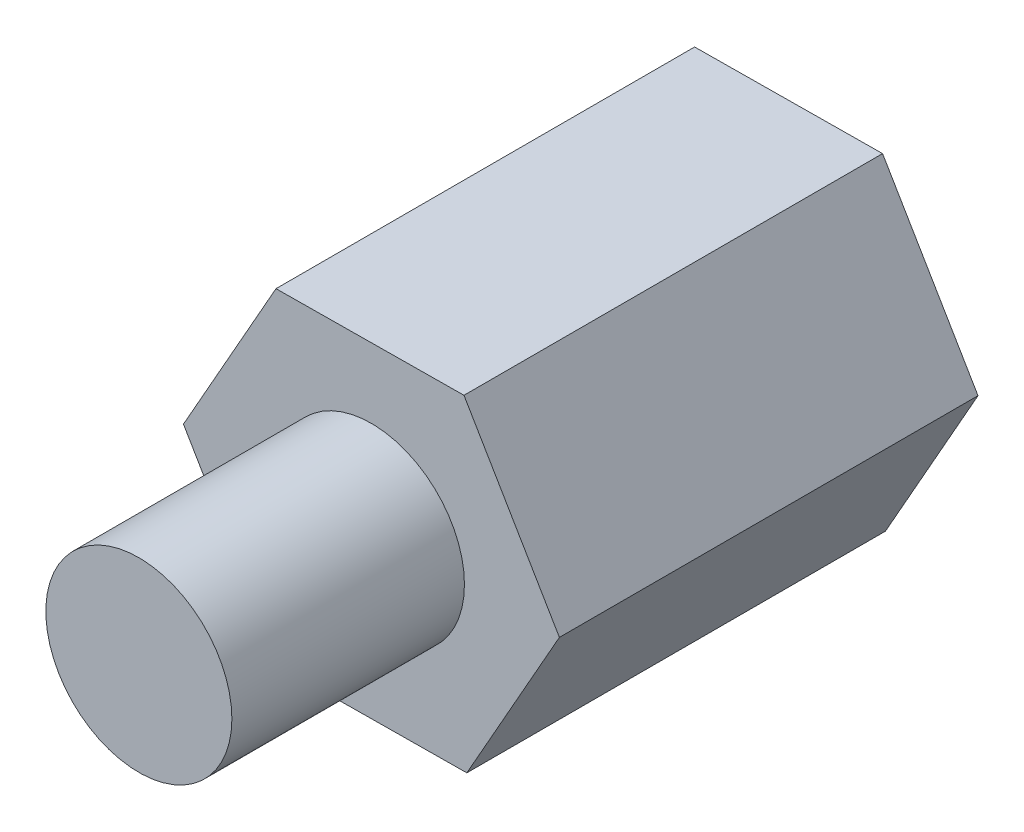
ISO-10303-21;
HEADER;
FILE_DESCRIPTION(('STEP AP214'),'2;1');
FILE_NAME('part.step','',(''),(''),'','','');
FILE_SCHEMA(('AUTOMOTIVE_DESIGN { 1 0 10303 214 1 1 1 1 }'));
ENDSEC;
DATA;
#1=APPLICATION_CONTEXT('core data for automotive mechanical design processes');
#2=APPLICATION_PROTOCOL_DEFINITION('international standard','automotive_design',2000,#1);
#3=PRODUCT_CONTEXT('',#1,'mechanical');
#4=PRODUCT('Part','Part','',(#3));
#5=PRODUCT_RELATED_PRODUCT_CATEGORY('part','',(#4));
#6=PRODUCT_DEFINITION_FORMATION('','',#4);
#7=PRODUCT_DEFINITION_CONTEXT('part definition',#1,'design');
#8=PRODUCT_DEFINITION('design','',#6,#7);
#9=PRODUCT_DEFINITION_SHAPE('','',#8);
#10=(LENGTH_UNIT() NAMED_UNIT(*) SI_UNIT(.MILLI.,.METRE.));
#11=(NAMED_UNIT(*) PLANE_ANGLE_UNIT() SI_UNIT($,.RADIAN.));
#12=(NAMED_UNIT(*) SI_UNIT($,.STERADIAN.) SOLID_ANGLE_UNIT());
#13=UNCERTAINTY_MEASURE_WITH_UNIT(LENGTH_MEASURE(1.E-05),#10,'distance_accuracy_value','');
#14=(GEOMETRIC_REPRESENTATION_CONTEXT(3) GLOBAL_UNCERTAINTY_ASSIGNED_CONTEXT((#13)) GLOBAL_UNIT_ASSIGNED_CONTEXT((#10,
#11,#12)) REPRESENTATION_CONTEXT('',''));
#15=CARTESIAN_POINT('',(0.,0.,0.));
#16=DIRECTION('',(0.,0.,1.));
#17=DIRECTION('',(1.,0.,0.));
#18=AXIS2_PLACEMENT_3D('',#15,#16,#17);
#19=CARTESIAN_POINT('',(0.,0.,14.));
#20=DIRECTION('',(0.,0.,-1.));
#21=DIRECTION('',(-1.,0.,0.));
#22=AXIS2_PLACEMENT_3D('',#19,#20,#21);
#23=CYLINDRICAL_SURFACE('',#22,2.);
#24=CARTESIAN_POINT('',(0.,0.,14.));
#25=DIRECTION('',(0.,0.,1.));
#26=DIRECTION('',(1.,0.,0.));
#27=AXIS2_PLACEMENT_3D('',#24,#25,#26);
#28=CIRCLE('',#27,2.);
#29=CARTESIAN_POINT('',(2.,0.,14.));
#30=VERTEX_POINT('',#29);
#31=EDGE_CURVE('E11',#30,#30,#28,.T.);
#32=ORIENTED_EDGE('',*,*,#31,.F.);
#33=EDGE_LOOP('',(#32));
#34=FACE_BOUND('',#33,.T.);
#35=CARTESIAN_POINT('',(0.,0.,9.));
#36=DIRECTION('',(0.,0.,1.));
#37=DIRECTION('',(1.,0.,0.));
#38=AXIS2_PLACEMENT_3D('',#35,#36,#37);
#39=CIRCLE('',#38,2.);
#40=CARTESIAN_POINT('',(2.,0.,9.));
#41=VERTEX_POINT('',#40);
#42=EDGE_CURVE('E50',#41,#41,#39,.T.);
#43=ORIENTED_EDGE('',*,*,#42,.T.);
#44=EDGE_LOOP('',(#43));
#45=FACE_BOUND('',#44,.T.);
#46=ADVANCED_FACE('F47',(#34,#45),#23,.T.);
#47=CARTESIAN_POINT('',(0.,0.,14.));
#48=DIRECTION('',(0.,0.,1.));
#49=DIRECTION('',(1.,0.,0.));
#50=AXIS2_PLACEMENT_3D('',#47,#48,#49);
#51=PLANE('',#50);
#52=ORIENTED_EDGE('',*,*,#31,.T.);
#53=EDGE_LOOP('',(#52));
#54=FACE_BOUND('',#53,.T.);
#55=ADVANCED_FACE('F62',(#54),#51,.T.);
#56=CARTESIAN_POINT('',(0.,0.,9.));
#57=DIRECTION('',(0.,0.,1.));
#58=DIRECTION('',(1.,0.,0.));
#59=AXIS2_PLACEMENT_3D('',#56,#57,#58);
#60=PLANE('',#59);
#61=ORIENTED_EDGE('',*,*,#42,.F.);
#62=EDGE_LOOP('',(#61));
#63=FACE_BOUND('',#62,.T.);
#64=ADVANCED_FACE('F60',(#63),#60,.F.);
#65=CLOSED_SHELL('',(#46,#55,#64));
#66=MANIFOLD_SOLID_BREP('B2',#65);
#67=CARTESIAN_POINT('',(0.,0.,9.));
#68=DIRECTION('',(0.,0.,1.));
#69=DIRECTION('',(1.,0.,0.));
#70=AXIS2_PLACEMENT_3D('',#67,#68,#69);
#71=PLANE('',#70);
#72=DIRECTION('',(0.999961257640527,0.00880245522430722,0.));
#73=VECTOR('',#72,1.);
#74=CARTESIAN_POINT('',(-1.98983906118775,-3.51765175136834,9.));
#75=LINE('',#74,#73);
#76=CARTESIAN_POINT('',(-1.98983906118775,-3.51765175136834,9.));
#77=VERTEX_POINT('',#76);
#78=CARTESIAN_POINT('',(2.05145624775792,-3.48207705211536,9.));
#79=VERTEX_POINT('',#78);
#80=EDGE_CURVE('E195',#77,#79,#75,.T.);
#81=ORIENTED_EDGE('',*,*,#80,.T.);
#82=DIRECTION('',(0.492357478980338,0.870393079529086,0.));
#83=VECTOR('',#82,1.);
#84=CARTESIAN_POINT('',(2.05145624775792,-3.48207705211536,9.));
#85=LINE('',#84,#83);
#86=CARTESIAN_POINT('',(4.04129530894568,0.0355746992529791,9.));
#87=VERTEX_POINT('',#86);
#88=EDGE_CURVE('E143',#79,#87,#85,.T.);
#89=ORIENTED_EDGE('',*,*,#88,.T.);
#90=DIRECTION('',(-0.507603778660189,0.861590624304779,0.));
#91=VECTOR('',#90,1.);
#92=CARTESIAN_POINT('',(4.04129530894568,0.0355746992529791,9.));
#93=LINE('',#92,#91);
#94=CARTESIAN_POINT('',(1.98983906118776,3.51765175136834,9.));
#95=VERTEX_POINT('',#94);
#96=EDGE_CURVE('E156',#87,#95,#93,.T.);
#97=ORIENTED_EDGE('',*,*,#96,.T.);
#98=DIRECTION('',(-0.999961257640527,-0.00880245522430723,0.));
#99=VECTOR('',#98,1.);
#100=CARTESIAN_POINT('',(1.98983906118776,3.51765175136834,9.));
#101=LINE('',#100,#99);
#102=CARTESIAN_POINT('',(-2.05145624775791,3.48207705211536,9.));
#103=VERTEX_POINT('',#102);
#104=EDGE_CURVE('E150',#95,#103,#101,.T.);
#105=ORIENTED_EDGE('',*,*,#104,.T.);
#106=DIRECTION('',(-0.492357478980338,-0.870393079529086,0.));
#107=VECTOR('',#106,1.);
#108=CARTESIAN_POINT('',(-2.05145624775791,3.48207705211536,9.));
#109=LINE('',#108,#107);
#110=CARTESIAN_POINT('',(-4.04129530894568,-0.0355746992529825,9.));
#111=VERTEX_POINT('',#110);
#112=EDGE_CURVE('E154',#103,#111,#109,.T.);
#113=ORIENTED_EDGE('',*,*,#112,.T.);
#114=DIRECTION('',(0.507603778660189,-0.861590624304779,0.));
#115=VECTOR('',#114,1.);
#116=CARTESIAN_POINT('',(-4.04129530894568,-0.0355746992529825,9.));
#117=LINE('',#116,#115);
#118=EDGE_CURVE('E106',#111,#77,#117,.T.);
#119=ORIENTED_EDGE('',*,*,#118,.T.);
#120=EDGE_LOOP('',(#81,#89,#97,#105,#113,#119));
#121=FACE_BOUND('',#120,.T.);
#122=CARTESIAN_POINT('',(0.,0.,9.));
#123=DIRECTION('',(0.,0.,1.));
#124=DIRECTION('',(1.,0.,0.));
#125=AXIS2_PLACEMENT_3D('',#122,#123,#124);
#126=CIRCLE('',#125,2.);
#127=CARTESIAN_POINT('',(2.,0.,9.));
#128=VERTEX_POINT('',#127);
#129=EDGE_CURVE('E183',#128,#128,#126,.T.);
#130=ORIENTED_EDGE('',*,*,#129,.F.);
#131=EDGE_LOOP('',(#130));
#132=FACE_BOUND('',#131,.T.);
#133=ADVANCED_FACE('F88',(#121,#132),#71,.T.);
#134=CARTESIAN_POINT('',(0.,0.,0.));
#135=DIRECTION('',(0.,0.,1.));
#136=DIRECTION('',(1.,0.,0.));
#137=AXIS2_PLACEMENT_3D('',#134,#135,#136);
#138=PLANE('',#137);
#139=DIRECTION('',(0.999961257640527,0.00880245522430722,0.));
#140=VECTOR('',#139,1.);
#141=CARTESIAN_POINT('',(-1.98983906118775,-3.51765175136834,0.));
#142=LINE('',#141,#140);
#143=CARTESIAN_POINT('',(-1.98983906118775,-3.51765175136834,0.));
#144=VERTEX_POINT('',#143);
#145=CARTESIAN_POINT('',(2.05145624775792,-3.48207705211536,0.));
#146=VERTEX_POINT('',#145);
#147=EDGE_CURVE('E178',#144,#146,#142,.T.);
#148=ORIENTED_EDGE('',*,*,#147,.F.);
#149=DIRECTION('',(0.507603778660189,-0.861590624304779,0.));
#150=VECTOR('',#149,1.);
#151=CARTESIAN_POINT('',(-4.04129530894568,-0.0355746992529825,0.));
#152=LINE('',#151,#150);
#153=CARTESIAN_POINT('',(-4.04129530894568,-0.0355746992529825,0.));
#154=VERTEX_POINT('',#153);
#155=EDGE_CURVE('E135',#154,#144,#152,.T.);
#156=ORIENTED_EDGE('',*,*,#155,.F.);
#157=DIRECTION('',(-0.492357478980338,-0.870393079529086,0.));
#158=VECTOR('',#157,1.);
#159=CARTESIAN_POINT('',(-2.05145624775791,3.48207705211536,0.));
#160=LINE('',#159,#158);
#161=CARTESIAN_POINT('',(-2.05145624775791,3.48207705211536,0.));
#162=VERTEX_POINT('',#161);
#163=EDGE_CURVE('E129',#162,#154,#160,.T.);
#164=ORIENTED_EDGE('',*,*,#163,.F.);
#165=DIRECTION('',(-0.999961257640527,-0.00880245522430723,0.));
#166=VECTOR('',#165,1.);
#167=CARTESIAN_POINT('',(1.98983906118776,3.51765175136834,0.));
#168=LINE('',#167,#166);
#169=CARTESIAN_POINT('',(1.98983906118776,3.51765175136834,0.));
#170=VERTEX_POINT('',#169);
#171=EDGE_CURVE('E165',#170,#162,#168,.T.);
#172=ORIENTED_EDGE('',*,*,#171,.F.);
#173=DIRECTION('',(-0.507603778660189,0.861590624304779,0.));
#174=VECTOR('',#173,1.);
#175=CARTESIAN_POINT('',(4.04129530894568,0.0355746992529791,0.));
#176=LINE('',#175,#174);
#177=CARTESIAN_POINT('',(4.04129530894568,0.0355746992529791,0.));
#178=VERTEX_POINT('',#177);
#179=EDGE_CURVE('E186',#178,#170,#176,.T.);
#180=ORIENTED_EDGE('',*,*,#179,.F.);
#181=DIRECTION('',(0.492357478980338,0.870393079529086,0.));
#182=VECTOR('',#181,1.);
#183=CARTESIAN_POINT('',(2.05145624775792,-3.48207705211536,0.));
#184=LINE('',#183,#182);
#185=EDGE_CURVE('E182',#146,#178,#184,.T.);
#186=ORIENTED_EDGE('',*,*,#185,.F.);
#187=EDGE_LOOP('',(#148,#156,#164,#172,#180,#186));
#188=FACE_BOUND('',#187,.T.);
#189=CARTESIAN_POINT('',(0.,0.,0.));
#190=DIRECTION('',(0.,0.,1.));
#191=DIRECTION('',(1.,0.,0.));
#192=AXIS2_PLACEMENT_3D('',#189,#190,#191);
#193=CIRCLE('',#192,2.);
#194=CARTESIAN_POINT('',(2.,0.,0.));
#195=VERTEX_POINT('',#194);
#196=EDGE_CURVE('E292',#195,#195,#193,.T.);
#197=ORIENTED_EDGE('',*,*,#196,.T.);
#198=EDGE_LOOP('',(#197));
#199=FACE_BOUND('',#198,.T.);
#200=ADVANCED_FACE('F208',(#188,#199),#138,.F.);
#201=CARTESIAN_POINT('',(-1.98983906118775,-3.51765175136834,9.));
#202=DIRECTION('',(-0.00880245522430722,0.999961257640527,0.));
#203=DIRECTION('',(-0.999961257640527,-0.00880245522430722,0.));
#204=AXIS2_PLACEMENT_3D('',#201,#202,#203);
#205=PLANE('',#204);
#206=ORIENTED_EDGE('',*,*,#147,.T.);
#207=DIRECTION('',(0.,0.,-1.));
#208=VECTOR('',#207,1.);
#209=CARTESIAN_POINT('',(2.05145624775792,-3.48207705211536,9.));
#210=LINE('',#209,#208);
#211=EDGE_CURVE('E45',#79,#146,#210,.T.);
#212=ORIENTED_EDGE('',*,*,#211,.F.);
#213=ORIENTED_EDGE('',*,*,#80,.F.);
#214=DIRECTION('',(0.,0.,-1.));
#215=VECTOR('',#214,1.);
#216=CARTESIAN_POINT('',(-1.98983906118775,-3.51765175136834,9.));
#217=LINE('',#216,#215);
#218=EDGE_CURVE('E174',#77,#144,#217,.T.);
#219=ORIENTED_EDGE('',*,*,#218,.T.);
#220=EDGE_LOOP('',(#206,#212,#213,#219));
#221=FACE_BOUND('',#220,.T.);
#222=ADVANCED_FACE('F90',(#221),#205,.F.);
#223=CARTESIAN_POINT('',(2.05145624775792,-3.48207705211536,9.));
#224=DIRECTION('',(-0.870393079529086,0.492357478980338,0.));
#225=DIRECTION('',(-0.492357478980338,-0.870393079529086,0.));
#226=AXIS2_PLACEMENT_3D('',#223,#224,#225);
#227=PLANE('',#226);
#228=ORIENTED_EDGE('',*,*,#185,.T.);
#229=DIRECTION('',(0.,0.,-1.));
#230=VECTOR('',#229,1.);
#231=CARTESIAN_POINT('',(4.04129530894568,0.0355746992529791,9.));
#232=LINE('',#231,#230);
#233=EDGE_CURVE('E98',#87,#178,#232,.T.);
#234=ORIENTED_EDGE('',*,*,#233,.F.);
#235=ORIENTED_EDGE('',*,*,#88,.F.);
#236=ORIENTED_EDGE('',*,*,#211,.T.);
#237=EDGE_LOOP('',(#228,#234,#235,#236));
#238=FACE_BOUND('',#237,.T.);
#239=ADVANCED_FACE('F233',(#238),#227,.F.);
#240=CARTESIAN_POINT('',(4.04129530894568,0.0355746992529791,9.));
#241=DIRECTION('',(-0.861590624304778,-0.507603778660189,0.));
#242=DIRECTION('',(0.507603778660189,-0.861590624304779,0.));
#243=AXIS2_PLACEMENT_3D('',#240,#241,#242);
#244=PLANE('',#243);
#245=ORIENTED_EDGE('',*,*,#179,.T.);
#246=DIRECTION('',(0.,0.,-1.));
#247=VECTOR('',#246,1.);
#248=CARTESIAN_POINT('',(1.98983906118776,3.51765175136834,9.));
#249=LINE('',#248,#247);
#250=EDGE_CURVE('E167',#95,#170,#249,.T.);
#251=ORIENTED_EDGE('',*,*,#250,.F.);
#252=ORIENTED_EDGE('',*,*,#96,.F.);
#253=ORIENTED_EDGE('',*,*,#233,.T.);
#254=EDGE_LOOP('',(#245,#251,#252,#253));
#255=FACE_BOUND('',#254,.T.);
#256=ADVANCED_FACE('F205',(#255),#244,.F.);
#257=CARTESIAN_POINT('',(1.98983906118776,3.51765175136834,9.));
#258=DIRECTION('',(0.00880245522430723,-0.999961257640527,0.));
#259=DIRECTION('',(0.999961257640527,0.00880245522430723,0.));
#260=AXIS2_PLACEMENT_3D('',#257,#258,#259);
#261=PLANE('',#260);
#262=ORIENTED_EDGE('',*,*,#171,.T.);
#263=DIRECTION('',(0.,0.,-1.));
#264=VECTOR('',#263,1.);
#265=CARTESIAN_POINT('',(-2.05145624775791,3.48207705211536,9.));
#266=LINE('',#265,#264);
#267=EDGE_CURVE('E162',#103,#162,#266,.T.);
#268=ORIENTED_EDGE('',*,*,#267,.F.);
#269=ORIENTED_EDGE('',*,*,#104,.F.);
#270=ORIENTED_EDGE('',*,*,#250,.T.);
#271=EDGE_LOOP('',(#262,#268,#269,#270));
#272=FACE_BOUND('',#271,.T.);
#273=ADVANCED_FACE('F163',(#272),#261,.F.);
#274=CARTESIAN_POINT('',(-2.05145624775791,3.48207705211536,9.));
#275=DIRECTION('',(0.870393079529086,-0.492357478980338,0.));
#276=DIRECTION('',(0.492357478980338,0.870393079529086,0.));
#277=AXIS2_PLACEMENT_3D('',#274,#275,#276);
#278=PLANE('',#277);
#279=ORIENTED_EDGE('',*,*,#163,.T.);
#280=DIRECTION('',(0.,0.,-1.));
#281=VECTOR('',#280,1.);
#282=CARTESIAN_POINT('',(-4.04129530894568,-0.0355746992529825,9.));
#283=LINE('',#282,#281);
#284=EDGE_CURVE('E168',#111,#154,#283,.T.);
#285=ORIENTED_EDGE('',*,*,#284,.F.);
#286=ORIENTED_EDGE('',*,*,#112,.F.);
#287=ORIENTED_EDGE('',*,*,#267,.T.);
#288=EDGE_LOOP('',(#279,#285,#286,#287));
#289=FACE_BOUND('',#288,.T.);
#290=ADVANCED_FACE('F170',(#289),#278,.F.);
#291=CARTESIAN_POINT('',(-4.04129530894568,-0.0355746992529825,9.));
#292=DIRECTION('',(0.861590624304779,0.507603778660189,0.));
#293=DIRECTION('',(-0.507603778660189,0.861590624304779,0.));
#294=AXIS2_PLACEMENT_3D('',#291,#292,#293);
#295=PLANE('',#294);
#296=ORIENTED_EDGE('',*,*,#155,.T.);
#297=ORIENTED_EDGE('',*,*,#218,.F.);
#298=ORIENTED_EDGE('',*,*,#118,.F.);
#299=ORIENTED_EDGE('',*,*,#284,.T.);
#300=EDGE_LOOP('',(#296,#297,#298,#299));
#301=FACE_BOUND('',#300,.T.);
#302=ADVANCED_FACE('F213',(#301),#295,.F.);
#303=CARTESIAN_POINT('',(0.,0.,9.));
#304=DIRECTION('',(0.,0.,-1.));
#305=DIRECTION('',(-1.,0.,0.));
#306=AXIS2_PLACEMENT_3D('',#303,#304,#305);
#307=CYLINDRICAL_SURFACE('',#306,2.);
#308=ORIENTED_EDGE('',*,*,#129,.T.);
#309=EDGE_LOOP('',(#308));
#310=FACE_BOUND('',#309,.T.);
#311=ORIENTED_EDGE('',*,*,#196,.F.);
#312=EDGE_LOOP('',(#311));
#313=FACE_BOUND('',#312,.T.);
#314=ADVANCED_FACE('F215',(#310,#313),#307,.F.);
#315=CLOSED_SHELL('',(#133,#200,#222,#239,#256,#273,#290,#302,#314));
#316=MANIFOLD_SOLID_BREP('B6',#315);
#317=ADVANCED_BREP_SHAPE_REPRESENTATION('',(#18,#66,#316),#14);
#318=SHAPE_DEFINITION_REPRESENTATION(#9,#317);
ENDSEC;
END-ISO-10303-21;
